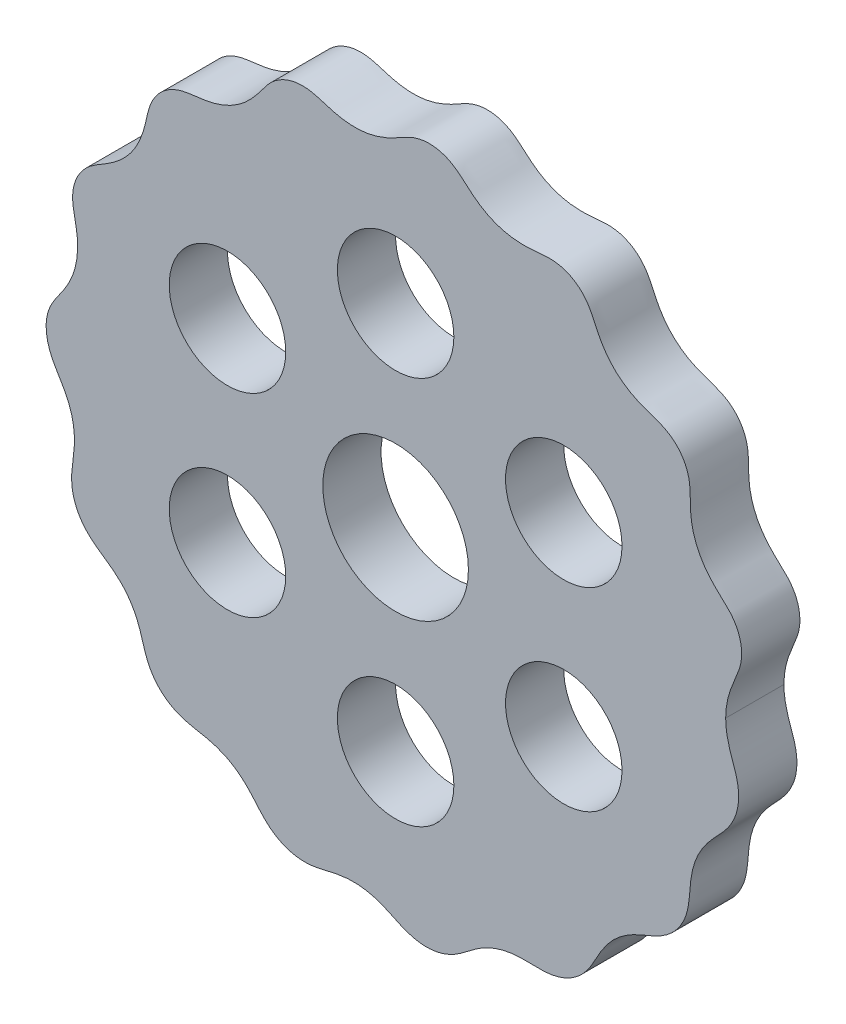
ISO-10303-21;
HEADER;
FILE_DESCRIPTION(('STEP AP214'),'2;1');
FILE_NAME('part.step','',(''),(''),'','','');
FILE_SCHEMA(('AUTOMOTIVE_DESIGN { 1 0 10303 214 1 1 1 1 }'));
ENDSEC;
DATA;
#1=APPLICATION_CONTEXT('core data for automotive mechanical design processes');
#2=APPLICATION_PROTOCOL_DEFINITION('international standard','automotive_design',2000,#1);
#3=PRODUCT_CONTEXT('',#1,'mechanical');
#4=PRODUCT('Part','Part','',(#3));
#5=PRODUCT_RELATED_PRODUCT_CATEGORY('part','',(#4));
#6=PRODUCT_DEFINITION_FORMATION('','',#4);
#7=PRODUCT_DEFINITION_CONTEXT('part definition',#1,'design');
#8=PRODUCT_DEFINITION('design','',#6,#7);
#9=PRODUCT_DEFINITION_SHAPE('','',#8);
#10=(LENGTH_UNIT() NAMED_UNIT(*) SI_UNIT(.MILLI.,.METRE.));
#11=(NAMED_UNIT(*) PLANE_ANGLE_UNIT() SI_UNIT($,.RADIAN.));
#12=(NAMED_UNIT(*) SI_UNIT($,.STERADIAN.) SOLID_ANGLE_UNIT());
#13=UNCERTAINTY_MEASURE_WITH_UNIT(LENGTH_MEASURE(1.E-05),#10,'distance_accuracy_value','');
#14=(GEOMETRIC_REPRESENTATION_CONTEXT(3) GLOBAL_UNCERTAINTY_ASSIGNED_CONTEXT((#13)) GLOBAL_UNIT_ASSIGNED_CONTEXT((#10,
#11,#12)) REPRESENTATION_CONTEXT('',''));
#15=CARTESIAN_POINT('',(0.,0.,0.));
#16=DIRECTION('',(0.,0.,1.));
#17=DIRECTION('',(1.,0.,0.));
#18=AXIS2_PLACEMENT_3D('',#15,#16,#17);
#19=CARTESIAN_POINT('',(33.9999778330542,0.,6.));
#20=CARTESIAN_POINT('',(33.9999582386087,0.228183089989129,6.));
#21=CARTESIAN_POINT('',(34.0167459934608,0.656452047963379,6.));
#22=CARTESIAN_POINT('',(34.0880773171331,1.2816899102247,6.));
#23=CARTESIAN_POINT('',(34.2663122514632,2.09233668141416,6.));
#24=CARTESIAN_POINT('',(34.5100402574252,2.85500321290993,6.));
#25=CARTESIAN_POINT('',(34.8290196473051,3.65501936744981,6.));
#26=CARTESIAN_POINT('',(35.2085863673881,4.4915049653763,6.));
#27=CARTESIAN_POINT('',(35.5972392107982,5.54756453449823,6.));
#28=CARTESIAN_POINT('',(35.7258169117513,6.85586574150502,6.));
#29=CARTESIAN_POINT('',(35.4647134850186,8.11090051834524,6.));
#30=CARTESIAN_POINT('',(34.8779639663519,9.19851543970629,6.));
#31=CARTESIAN_POINT('',(34.0796749819764,10.0967061974764,6.));
#32=CARTESIAN_POINT('',(33.1735909977777,10.8774347309762,6.));
#33=CARTESIAN_POINT('',(32.2197133598311,11.8371862296768,6.));
#34=CARTESIAN_POINT('',(31.3521738759437,13.0745174312376,6.));
#35=CARTESIAN_POINT('',(30.7401986033758,14.4567098229339,6.));
#36=CARTESIAN_POINT('',(30.4068471241229,15.9306563911616,6.));
#37=CARTESIAN_POINT('',(30.336175910127,17.2816613837377,6.));
#38=CARTESIAN_POINT('',(30.3620953861146,18.4775959702686,6.));
#39=CARTESIAN_POINT('',(30.2213186905391,19.6711372494043,6.));
#40=CARTESIAN_POINT('',(29.8066350274046,20.8086092685016,6.));
#41=CARTESIAN_POINT('',(29.086570751207,21.7902687832337,6.));
#42=CARTESIAN_POINT('',(28.125966437522,22.5272972451436,6.));
#43=CARTESIAN_POINT('',(27.0305304657638,23.0209477912322,6.));
#44=CARTESIAN_POINT('',(25.8851002190669,23.3654834792607,6.));
#45=CARTESIAN_POINT('',(24.6238833277634,23.8558411767164,6.));
#46=CARTESIAN_POINT('',(23.329119317603,24.6350349887215,6.));
#47=CARTESIAN_POINT('',(22.209422134961,25.6504695685708,6.));
#48=CARTESIAN_POINT('',(21.3069969449513,26.8625513693492,6.));
#49=CARTESIAN_POINT('',(20.6943571374257,28.0686427807888,6.));
#50=CARTESIAN_POINT('',(20.2314302939395,29.171730067991,6.));
#51=CARTESIAN_POINT('',(19.61509081782,30.2035877281515,6.));
#52=CARTESIAN_POINT('',(18.7715178883611,31.0719968916319,6.));
#53=CARTESIAN_POINT('',(17.7129956099512,31.6734082557788,6.));
#54=CARTESIAN_POINT('',(16.5349671026585,31.9531464495383,6.));
#55=CARTESIAN_POINT('',(15.3335036583515,31.9560411504276,6.));
#56=CARTESIAN_POINT('',(14.1469681143591,31.8048653548074,6.));
#57=CARTESIAN_POINT('',(12.7951965186699,31.741407901792,6.));
#58=CARTESIAN_POINT('',(11.2957561693692,31.9286316389394,6.));
#59=CARTESIAN_POINT('',(9.86058989795352,32.4029530027056,6.));
#60=CARTESIAN_POINT('',(8.54420059259727,33.1449070966544,6.));
#61=CARTESIAN_POINT('',(7.49497706019048,33.9986981181707,6.));
#62=CARTESIAN_POINT('',(6.62323588673544,34.8180525320015,6.));
#63=CARTESIAN_POINT('',(5.63886632947515,35.5079668611277,6.));
#64=CARTESIAN_POINT('',(4.51517510375975,35.9549564981424,6.));
#65=CARTESIAN_POINT('',(3.30782511719597,36.0710085077658,6.));
#66=CARTESIAN_POINT('',(2.12602546584793,35.8479176371124,6.));
#67=CARTESIAN_POINT('',(1.03474661898015,35.36751308196,6.));
#68=CARTESIAN_POINT('',(0.0196373351776417,34.7521262554792,6.));
#69=CARTESIAN_POINT('',(-1.18148345743592,34.1444477722018,6.));
#70=CARTESIAN_POINT('',(-2.6210488215956,33.7018156054838,6.));
#71=CARTESIAN_POINT('',(-4.11946006557312,33.5448788804975,6.));
#72=CARTESIAN_POINT('',(-5.61949935331476,33.6795334823496,6.));
#73=CARTESIAN_POINT('',(-6.9204762246916,34.0249254119513,6.));
#74=CARTESIAN_POINT('',(-8.04137525589883,34.4157732704649,6.));
#75=CARTESIAN_POINT('',(-9.20898095313966,34.6575607185649,6.));
#76=CARTESIAN_POINT('',(-10.411300211759,34.6285963624385,6.));
#77=CARTESIAN_POINT('',(-11.567697475318,34.2626758344416,6.));
#78=CARTESIAN_POINT('',(-12.5730910269794,33.5905946660738,6.));
#79=CARTESIAN_POINT('',(-13.3915054603063,32.7102397762244,6.));
#80=CARTESIAN_POINT('',(-14.0737297873233,31.7275291954276,6.));
#81=CARTESIAN_POINT('',(-14.9231190931441,30.6746982172873,6.));
#82=CARTESIAN_POINT('',(-16.057133773894,29.6759933871886,6.));
#83=CARTESIAN_POINT('',(-17.3628926828304,28.9145801249719,6.));
#84=CARTESIAN_POINT('',(-18.790998994427,28.4206359555158,6.));
#85=CARTESIAN_POINT('',(-20.126520240224,28.2024197165054,6.));
#86=CARTESIAN_POINT('',(-21.3185635069986,28.103571596997,6.));
#87=CARTESIAN_POINT('',(-22.4929366620818,27.8496912865206,6.));
#88=CARTESIAN_POINT('',(-23.5864200696788,27.3298039188296,6.));
#89=CARTESIAN_POINT('',(-24.4958011561164,26.520371159017,6.));
#90=CARTESIAN_POINT('',(-25.1391440777004,25.4947553607733,6.));
#91=CARTESIAN_POINT('',(-25.526223343432,24.3569289166232,6.));
#92=CARTESIAN_POINT('',(-25.7495926803989,23.1817212009888,6.));
#93=CARTESIAN_POINT('',(-26.0988273146321,21.8747640622342,6.));
#94=CARTESIAN_POINT('',(-26.7304320603804,20.5019364797606,6.));
#95=CARTESIAN_POINT('',(-27.6154485745189,19.2765183790746,6.));
#96=CARTESIAN_POINT('',(-28.7206199052791,18.2458806377954,6.));
#97=CARTESIAN_POINT('',(-29.8527123735666,17.5046840872158,6.));
#98=CARTESIAN_POINT('',(-30.901455131793,16.9294970827997,6.));
#99=CARTESIAN_POINT('',(-31.8695844361435,16.2178323415057,6.));
#100=CARTESIAN_POINT('',(-32.6548275722907,15.2962324243465,6.));
#101=CARTESIAN_POINT('',(-33.1537328627323,14.1857216740049,6.));
#102=CARTESIAN_POINT('',(-33.3213965629222,12.9866702695897,6.));
#103=CARTESIAN_POINT('',(-33.209657995365,11.7901119741777,6.));
#104=CARTESIAN_POINT('',(-32.9355752883917,10.6257389607653,6.));
#105=CARTESIAN_POINT('',(-32.7245770256088,9.28941551395651,6.));
#106=CARTESIAN_POINT('',(-32.7451534196813,7.77834761763928,6.));
#107=CARTESIAN_POINT('',(-33.0575150202973,6.2993735950604,6.));
#108=CARTESIAN_POINT('',(-33.6496839862451,4.90903330763856,6.));
#109=CARTESIAN_POINT('',(-34.3839357328533,3.77248408758148,6.));
#110=CARTESIAN_POINT('',(-35.1076456628644,2.82024573953037,6.));
#111=CARTESIAN_POINT('',(-35.607878014355,1.93924969101183,6.));
#112=CARTESIAN_POINT('',(-35.8805116156034,1.15882269935486,6.));
#113=CARTESIAN_POINT('',(-35.9793808622037,0.56521716066261,6.));
#114=CARTESIAN_POINT('',(-36.0000338817722,0.188775120943961,6.));
#115=CARTESIAN_POINT('',(-36.0000220706772,0.,6.));
#116=B_SPLINE_CURVE_WITH_KNOTS('',4,(#19,#20,#21,#22,#23,#24,#25,#26,#27,#28,#29,#30,#31,#32,
#33,#34,#35,#36,#37,#38,#39,#40,#41,#42,#43,#44,#45,#46,#47,#48,#49,#50,#51,#52,#53,#54,#55,#56,
#57,#58,#59,#60,#61,#62,#63,#64,#65,#66,#67,#68,#69,#70,#71,#72,#73,#74,#75,#76,#77,#78,#79,#80,
#81,#82,#83,#84,#85,#86,#87,#88,#89,#90,#91,#92,#93,#94,#95,#96,#97,#98,#99,#100,#101,#102,#103,
#104,#105,#106,#107,#108,#109,#110,#111,#112,#113,#114,#115),.UNSPECIFIED.,.F.,.F.,(5,1,1,1,1,1,
1,1,1,1,1,1,1,1,1,1,1,1,1,1,1,1,1,1,1,1,1,1,1,1,1,1,1,1,1,1,1,1,1,1,1,1,1,1,1,1,1,1,1,1,1,1,1,1,
1,1,1,1,1,1,1,1,1,1,1,1,1,1,1,1,1,1,1,1,1,1,1,1,1,1,1,1,1,1,1,1,1,1,1,1,1,1,1,5),
(0.11764758489827,0.123712417731234,0.129030178053502,0.134347938375769,0.139665698698036,
0.144983459020303,0.15189115648836,0.158798853956417,0.169437032133219,0.179415757090033,
0.185337291250825,0.191258825411617,0.201234407169665,0.211209988927714,0.221196437484353,
0.231182886040993,0.241158155609122,0.25113342517725,0.257054833385721,0.262976241594192,
0.272955005979324,0.282933715956385,0.288855305280604,0.294776894604823,0.304753064934742,
0.31472923526466,0.324714672149265,0.33470010903387,0.344675781916405,0.354651454798939,
0.360572828041754,0.366494201284569,0.376472978516404,0.386451672963794,0.392373323735329,
0.398294974506865,0.408271669463963,0.418248364421061,0.428232557801162,0.438216751181263,
0.44819311272311,0.458169474264956,0.464090816910954,0.470012159556952,0.47999094907712,
0.489936444745961,0.49577217370632,0.501607902666679,0.511549628293616,0.521491353920553,
0.531445711947387,0.541400069974221,0.55134167059386,0.561283271213498,0.567119001167881,
0.572954731122265,0.582900219822557,0.592879003268316,0.598800360687633,0.604721718106951,
0.614697699000446,0.624673679893942,0.634658413520395,0.644643147146849,0.654619698927079,
0.664596250707309,0.670517869940925,0.676439489174542,0.686418191455238,0.696396962333544,
0.702318352491721,0.708239742649898,0.718215178863613,0.728190615077329,0.738176623669682,
0.748162632262035,0.758138478743363,0.768114325224691,0.774035886210069,0.779957447195446,
0.789936164731374,0.799914922483703,0.805836349921885,0.811757777360066,0.821732948962338,
0.831708120564609,0.841694877193685,0.851681633822761,0.86165701148314,0.871632389143519,
0.877553897939325,0.883475406735132,0.888464772854771,0.893482590846806),.UNSPECIFIED.);
#117=DIRECTION('',(0.,0.,-1.));
#118=VECTOR('',#117,1.);
#119=SURFACE_OF_LINEAR_EXTRUSION('',#116,#118);
#120=CARTESIAN_POINT('',(33.9999778330542,0.,0.));
#121=CARTESIAN_POINT('',(33.9999582386087,0.228183089989129,0.));
#122=CARTESIAN_POINT('',(34.0167459934608,0.656452047963379,0.));
#123=CARTESIAN_POINT('',(34.0880773171331,1.2816899102247,0.));
#124=CARTESIAN_POINT('',(34.2663122514632,2.09233668141416,0.));
#125=CARTESIAN_POINT('',(34.5100402574252,2.85500321290993,0.));
#126=CARTESIAN_POINT('',(34.8290196473051,3.65501936744981,0.));
#127=CARTESIAN_POINT('',(35.2085863673881,4.4915049653763,0.));
#128=CARTESIAN_POINT('',(35.5972392107982,5.54756453449823,0.));
#129=CARTESIAN_POINT('',(35.7258169117513,6.85586574150502,0.));
#130=CARTESIAN_POINT('',(35.4647134850186,8.11090051834524,0.));
#131=CARTESIAN_POINT('',(34.8779639663519,9.19851543970629,0.));
#132=CARTESIAN_POINT('',(34.0796749819764,10.0967061974764,0.));
#133=CARTESIAN_POINT('',(33.1735909977777,10.8774347309762,0.));
#134=CARTESIAN_POINT('',(32.2197133598311,11.8371862296768,0.));
#135=CARTESIAN_POINT('',(31.3521738759437,13.0745174312376,0.));
#136=CARTESIAN_POINT('',(30.7401986033758,14.4567098229339,0.));
#137=CARTESIAN_POINT('',(30.4068471241229,15.9306563911616,0.));
#138=CARTESIAN_POINT('',(30.336175910127,17.2816613837377,0.));
#139=CARTESIAN_POINT('',(30.3620953861146,18.4775959702686,0.));
#140=CARTESIAN_POINT('',(30.2213186905391,19.6711372494043,0.));
#141=CARTESIAN_POINT('',(29.8066350274046,20.8086092685016,0.));
#142=CARTESIAN_POINT('',(29.086570751207,21.7902687832337,0.));
#143=CARTESIAN_POINT('',(28.125966437522,22.5272972451436,0.));
#144=CARTESIAN_POINT('',(27.0305304657638,23.0209477912322,0.));
#145=CARTESIAN_POINT('',(25.8851002190669,23.3654834792607,0.));
#146=CARTESIAN_POINT('',(24.6238833277634,23.8558411767164,0.));
#147=CARTESIAN_POINT('',(23.329119317603,24.6350349887215,0.));
#148=CARTESIAN_POINT('',(22.209422134961,25.6504695685708,0.));
#149=CARTESIAN_POINT('',(21.3069969449513,26.8625513693492,0.));
#150=CARTESIAN_POINT('',(20.6943571374257,28.0686427807888,0.));
#151=CARTESIAN_POINT('',(20.2314302939395,29.171730067991,0.));
#152=CARTESIAN_POINT('',(19.61509081782,30.2035877281515,0.));
#153=CARTESIAN_POINT('',(18.7715178883611,31.0719968916319,0.));
#154=CARTESIAN_POINT('',(17.7129956099512,31.6734082557788,0.));
#155=CARTESIAN_POINT('',(16.5349671026585,31.9531464495383,0.));
#156=CARTESIAN_POINT('',(15.3335036583515,31.9560411504276,0.));
#157=CARTESIAN_POINT('',(14.1469681143591,31.8048653548074,0.));
#158=CARTESIAN_POINT('',(12.7951965186699,31.741407901792,0.));
#159=CARTESIAN_POINT('',(11.2957561693692,31.9286316389394,0.));
#160=CARTESIAN_POINT('',(9.86058989795352,32.4029530027056,0.));
#161=CARTESIAN_POINT('',(8.54420059259727,33.1449070966544,0.));
#162=CARTESIAN_POINT('',(7.49497706019048,33.9986981181707,0.));
#163=CARTESIAN_POINT('',(6.62323588673544,34.8180525320015,0.));
#164=CARTESIAN_POINT('',(5.63886632947515,35.5079668611277,0.));
#165=CARTESIAN_POINT('',(4.51517510375975,35.9549564981424,0.));
#166=CARTESIAN_POINT('',(3.30782511719597,36.0710085077658,0.));
#167=CARTESIAN_POINT('',(2.12602546584793,35.8479176371124,0.));
#168=CARTESIAN_POINT('',(1.03474661898015,35.36751308196,0.));
#169=CARTESIAN_POINT('',(0.0196373351776417,34.7521262554792,0.));
#170=CARTESIAN_POINT('',(-1.18148345743592,34.1444477722018,0.));
#171=CARTESIAN_POINT('',(-2.6210488215956,33.7018156054838,0.));
#172=CARTESIAN_POINT('',(-4.11946006557312,33.5448788804975,0.));
#173=CARTESIAN_POINT('',(-5.61949935331476,33.6795334823496,0.));
#174=CARTESIAN_POINT('',(-6.9204762246916,34.0249254119513,0.));
#175=CARTESIAN_POINT('',(-8.04137525589883,34.4157732704649,0.));
#176=CARTESIAN_POINT('',(-9.20898095313966,34.6575607185649,0.));
#177=CARTESIAN_POINT('',(-10.411300211759,34.6285963624385,0.));
#178=CARTESIAN_POINT('',(-11.567697475318,34.2626758344416,0.));
#179=CARTESIAN_POINT('',(-12.5730910269794,33.5905946660738,0.));
#180=CARTESIAN_POINT('',(-13.3915054603063,32.7102397762244,0.));
#181=CARTESIAN_POINT('',(-14.0737297873233,31.7275291954276,0.));
#182=CARTESIAN_POINT('',(-14.9231190931441,30.6746982172873,0.));
#183=CARTESIAN_POINT('',(-16.057133773894,29.6759933871886,0.));
#184=CARTESIAN_POINT('',(-17.3628926828304,28.9145801249719,0.));
#185=CARTESIAN_POINT('',(-18.790998994427,28.4206359555158,0.));
#186=CARTESIAN_POINT('',(-20.126520240224,28.2024197165054,0.));
#187=CARTESIAN_POINT('',(-21.3185635069986,28.103571596997,0.));
#188=CARTESIAN_POINT('',(-22.4929366620818,27.8496912865206,0.));
#189=CARTESIAN_POINT('',(-23.5864200696788,27.3298039188296,0.));
#190=CARTESIAN_POINT('',(-24.4958011561164,26.520371159017,0.));
#191=CARTESIAN_POINT('',(-25.1391440777004,25.4947553607733,0.));
#192=CARTESIAN_POINT('',(-25.526223343432,24.3569289166232,0.));
#193=CARTESIAN_POINT('',(-25.7495926803989,23.1817212009888,0.));
#194=CARTESIAN_POINT('',(-26.0988273146321,21.8747640622342,0.));
#195=CARTESIAN_POINT('',(-26.7304320603804,20.5019364797606,0.));
#196=CARTESIAN_POINT('',(-27.6154485745189,19.2765183790746,0.));
#197=CARTESIAN_POINT('',(-28.7206199052791,18.2458806377954,0.));
#198=CARTESIAN_POINT('',(-29.8527123735666,17.5046840872158,0.));
#199=CARTESIAN_POINT('',(-30.901455131793,16.9294970827997,0.));
#200=CARTESIAN_POINT('',(-31.8695844361435,16.2178323415057,0.));
#201=CARTESIAN_POINT('',(-32.6548275722907,15.2962324243465,0.));
#202=CARTESIAN_POINT('',(-33.1537328627323,14.1857216740049,0.));
#203=CARTESIAN_POINT('',(-33.3213965629222,12.9866702695897,0.));
#204=CARTESIAN_POINT('',(-33.209657995365,11.7901119741777,0.));
#205=CARTESIAN_POINT('',(-32.9355752883917,10.6257389607653,0.));
#206=CARTESIAN_POINT('',(-32.7245770256088,9.28941551395651,0.));
#207=CARTESIAN_POINT('',(-32.7451534196813,7.77834761763928,0.));
#208=CARTESIAN_POINT('',(-33.0575150202973,6.2993735950604,0.));
#209=CARTESIAN_POINT('',(-33.6496839862451,4.90903330763856,0.));
#210=CARTESIAN_POINT('',(-34.3839357328533,3.77248408758148,0.));
#211=CARTESIAN_POINT('',(-35.1076456628644,2.82024573953037,0.));
#212=CARTESIAN_POINT('',(-35.607878014355,1.93924969101183,0.));
#213=CARTESIAN_POINT('',(-35.8805116156034,1.15882269935486,0.));
#214=CARTESIAN_POINT('',(-35.9793808622037,0.56521716066261,0.));
#215=CARTESIAN_POINT('',(-36.0000338817722,0.188775120943961,0.));
#216=CARTESIAN_POINT('',(-36.0000220706772,0.,0.));
#217=B_SPLINE_CURVE_WITH_KNOTS('',4,(#120,#121,#122,#123,#124,#125,#126,#127,#128,#129,#130,
#131,#132,#133,#134,#135,#136,#137,#138,#139,#140,#141,#142,#143,#144,#145,#146,#147,#148,#149,
#150,#151,#152,#153,#154,#155,#156,#157,#158,#159,#160,#161,#162,#163,#164,#165,#166,#167,#168,
#169,#170,#171,#172,#173,#174,#175,#176,#177,#178,#179,#180,#181,#182,#183,#184,#185,#186,#187,
#188,#189,#190,#191,#192,#193,#194,#195,#196,#197,#198,#199,#200,#201,#202,#203,#204,#205,#206,
#207,#208,#209,#210,#211,#212,#213,#214,#215,#216),.UNSPECIFIED.,.F.,.F.,(5,1,1,1,1,1,1,1,1,1,1,
1,1,1,1,1,1,1,1,1,1,1,1,1,1,1,1,1,1,1,1,1,1,1,1,1,1,1,1,1,1,1,1,1,1,1,1,1,1,1,1,1,1,1,1,1,1,1,1,
1,1,1,1,1,1,1,1,1,1,1,1,1,1,1,1,1,1,1,1,1,1,1,1,1,1,1,1,1,1,1,1,1,1,5),(0.11764758489827,
0.123712417731234,0.129030178053502,0.134347938375769,0.139665698698036,0.144983459020303,
0.15189115648836,0.158798853956417,0.169437032133219,0.179415757090033,0.185337291250825,
0.191258825411617,0.201234407169665,0.211209988927714,0.221196437484353,0.231182886040993,
0.241158155609122,0.25113342517725,0.257054833385721,0.262976241594192,0.272955005979324,
0.282933715956385,0.288855305280604,0.294776894604823,0.304753064934742,0.31472923526466,
0.324714672149265,0.33470010903387,0.344675781916405,0.354651454798939,0.360572828041754,
0.366494201284569,0.376472978516404,0.386451672963794,0.392373323735329,0.398294974506865,
0.408271669463963,0.418248364421061,0.428232557801162,0.438216751181263,0.44819311272311,
0.458169474264956,0.464090816910954,0.470012159556952,0.47999094907712,0.489936444745961,
0.49577217370632,0.501607902666679,0.511549628293616,0.521491353920553,0.531445711947387,
0.541400069974221,0.55134167059386,0.561283271213498,0.567119001167881,0.572954731122265,
0.582900219822557,0.592879003268316,0.598800360687633,0.604721718106951,0.614697699000446,
0.624673679893942,0.634658413520395,0.644643147146849,0.654619698927079,0.664596250707309,
0.670517869940925,0.676439489174542,0.686418191455238,0.696396962333544,0.702318352491721,
0.708239742649898,0.718215178863613,0.728190615077329,0.738176623669682,0.748162632262035,
0.758138478743363,0.768114325224691,0.774035886210069,0.779957447195446,0.789936164731374,
0.799914922483703,0.805836349921885,0.811757777360066,0.821732948962338,0.831708120564609,
0.841694877193685,0.851681633822761,0.86165701148314,0.871632389143519,0.877553897939325,
0.883475406735132,0.888464772854771,0.893482590846806),.UNSPECIFIED.);
#218=CARTESIAN_POINT('',(33.9999778330542,7.6549099124626E-13,0.));
#219=VERTEX_POINT('',#218);
#220=CARTESIAN_POINT('',(-36.0000220706769,-5.62943543193529E-10,0.));
#221=VERTEX_POINT('',#220);
#222=EDGE_CURVE('E75',#219,#221,#217,.T.);
#223=ORIENTED_EDGE('',*,*,#222,.T.);
#224=DIRECTION('',(0.,0.,-1.));
#225=VECTOR('',#224,1.);
#226=CARTESIAN_POINT('',(-36.0000220706769,-5.62943543193529E-10,6.));
#227=LINE('',#226,#225);
#228=CARTESIAN_POINT('',(-36.0000220706769,-5.62943543193529E-10,6.));
#229=VERTEX_POINT('',#228);
#230=EDGE_CURVE('E11',#229,#221,#227,.T.);
#231=ORIENTED_EDGE('',*,*,#230,.F.);
#232=CARTESIAN_POINT('',(33.9999778330542,7.6549099124626E-13,6.));
#233=VERTEX_POINT('',#232);
#234=EDGE_CURVE('E74',#233,#229,#116,.T.);
#235=ORIENTED_EDGE('',*,*,#234,.F.);
#236=DIRECTION('',(0.,0.,-1.));
#237=VECTOR('',#236,1.);
#238=CARTESIAN_POINT('',(33.9999778330542,7.6549099124626E-13,6.));
#239=LINE('',#238,#237);
#240=EDGE_CURVE('E52',#233,#219,#239,.T.);
#241=ORIENTED_EDGE('',*,*,#240,.T.);
#242=EDGE_LOOP('',(#223,#231,#235,#241));
#243=FACE_BOUND('',#242,.T.);
#244=ADVANCED_FACE('F43',(#243),#119,.F.);
#245=CARTESIAN_POINT('',(-36.0000220706769,-5.62943543193529E-10,6.));
#246=CARTESIAN_POINT('',(-36.0000065394833,-0.035587452021318,6.));
#247=CARTESIAN_POINT('',(-35.9993566360993,-0.0892186674692923,6.));
#248=CARTESIAN_POINT('',(-35.9972275133063,-0.182583996635181,6.));
#249=CARTESIAN_POINT('',(-35.9924701459357,-0.294036464658167,6.));
#250=CARTESIAN_POINT('',(-35.987393491433,-0.37929454165697,6.));
#251=CARTESIAN_POINT('',(-35.9794724767395,-0.482964700256424,6.));
#252=CARTESIAN_POINT('',(-35.9674508238095,-0.607434226564926,6.));
#253=CARTESIAN_POINT('',(-35.949768502872,-0.754373951912758,6.));
#254=CARTESIAN_POINT('',(-35.9245789790743,-0.92071979607577,6.));
#255=CARTESIAN_POINT('',(-35.8944505516151,-1.08626622648199,6.));
#256=CARTESIAN_POINT('',(-35.8331835910926,-1.37437747352898,6.));
#257=CARTESIAN_POINT('',(-35.7215890492575,-1.78042168887151,6.));
#258=CARTESIAN_POINT('',(-35.5347848720043,-2.28560963035172,6.));
#259=CARTESIAN_POINT('',(-35.2470757855512,-2.87425398505704,6.));
#260=CARTESIAN_POINT('',(-34.9229913770931,-3.43217737616594,6.));
#261=CARTESIAN_POINT('',(-34.5881332018933,-3.97238305528121,6.));
#262=CARTESIAN_POINT('',(-34.2240073584578,-4.57834573717451,6.));
#263=CARTESIAN_POINT('',(-33.8574540726477,-5.26542107290376,6.));
#264=CARTESIAN_POINT('',(-33.5484237086123,-5.99156499783688,6.));
#265=CARTESIAN_POINT('',(-33.3143015734883,-6.75500541517757,6.));
#266=CARTESIAN_POINT('',(-33.151780812424,-7.56287004960922,6.));
#267=CARTESIAN_POINT('',(-33.0701335332422,-8.40954667444264,6.));
#268=CARTESIAN_POINT('',(-33.0854282095193,-9.38414879507724,6.));
#269=CARTESIAN_POINT('',(-33.2137837264978,-10.4733681405721,6.));
#270=CARTESIAN_POINT('',(-33.3891198926942,-11.6366247862912,6.));
#271=CARTESIAN_POINT('',(-33.4088352859984,-12.9009344917495,6.));
#272=CARTESIAN_POINT('',(-33.1376762381004,-14.1875727698279,6.));
#273=CARTESIAN_POINT('',(-32.5494026830376,-15.4123266749087,6.));
#274=CARTESIAN_POINT('',(-31.7964126256323,-16.3271606526055,6.));
#275=CARTESIAN_POINT('',(-31.0280300525459,-16.9711805211944,6.));
#276=CARTESIAN_POINT('',(-30.2174930398594,-17.5401900902958,6.));
#277=CARTESIAN_POINT('',(-29.3222070695194,-18.1419645882163,6.));
#278=CARTESIAN_POINT('',(-28.3432265614791,-18.9311154274278,6.));
#279=CARTESIAN_POINT('',(-27.4599628253411,-19.959232839154,6.));
#280=CARTESIAN_POINT('',(-26.8127933213575,-21.0635410260059,6.));
#281=CARTESIAN_POINT('',(-26.3784010601342,-22.1126546194113,6.));
#282=CARTESIAN_POINT('',(-26.0637292054357,-23.1451846870684,6.));
#283=CARTESIAN_POINT('',(-25.7503603018565,-24.2611809296458,6.));
#284=CARTESIAN_POINT('',(-25.2537692534519,-25.4044220502984,6.));
#285=CARTESIAN_POINT('',(-24.4832679165418,-26.4585840687755,6.));
#286=CARTESIAN_POINT('',(-23.4434139422606,-27.3333611527097,6.));
#287=CARTESIAN_POINT('',(-22.3770738472238,-27.8597771301477,6.));
#288=CARTESIAN_POINT('',(-21.4031548284599,-28.1334895656854,6.));
#289=CARTESIAN_POINT('',(-20.5781912687492,-28.2919876867001,6.));
#290=CARTESIAN_POINT('',(-19.9174275896504,-28.4116168826251,6.));
#291=CARTESIAN_POINT('',(-19.0257886944982,-28.6003393425514,6.));
#292=CARTESIAN_POINT('',(-17.9899068405375,-28.9158489527288,6.));
#293=CARTESIAN_POINT('',(-16.9214177197429,-29.4299635886853,6.));
#294=CARTESIAN_POINT('',(-15.8846572224785,-30.1811796943348,6.));
#295=CARTESIAN_POINT('',(-15.0539624661726,-30.9806483338331,6.));
#296=CARTESIAN_POINT('',(-14.3407064181957,-31.8131244082474,6.));
#297=CARTESIAN_POINT('',(-13.5904183856599,-32.7073505861721,6.));
#298=CARTESIAN_POINT('',(-12.6589218103666,-33.5353224211952,6.));
#299=CARTESIAN_POINT('',(-11.5163846505849,-34.1653336776814,6.));
#300=CARTESIAN_POINT('',(-10.3517115162416,-34.4801655982209,6.));
#301=CARTESIAN_POINT('',(-9.30484756757346,-34.5412025731469,6.));
#302=CARTESIAN_POINT('',(-8.2640184090618,-34.4419393897703,6.));
#303=CARTESIAN_POINT('',(-7.2456727993519,-34.2103326891867,6.));
#304=CARTESIAN_POINT('',(-6.03823842549489,-33.8967568454827,6.));
#305=CARTESIAN_POINT('',(-4.64304178356501,-33.7202270280699,6.));
#306=CARTESIAN_POINT('',(-3.29933531545874,-33.7924531233624,6.));
#307=CARTESIAN_POINT('',(-2.05286803834594,-34.0856034296582,6.));
#308=CARTESIAN_POINT('',(-0.97713549426737,-34.5009029210439,6.));
#309=CARTESIAN_POINT('',(-0.00758589651340478,-34.9741927707536,6.));
#310=CARTESIAN_POINT('',(1.02609954780046,-35.4596639217677,6.));
#311=CARTESIAN_POINT('',(2.18722226415819,-35.8034128326469,6.));
#312=CARTESIAN_POINT('',(3.47163571878525,-35.8916317312475,6.));
#313=CARTESIAN_POINT('',(4.84476166273807,-35.6528739754701,6.));
#314=CARTESIAN_POINT('',(5.9633244056776,-35.1529189806905,6.));
#315=CARTESIAN_POINT('',(6.82398883733321,-34.5580390481195,6.));
#316=CARTESIAN_POINT('',(7.64834936047422,-33.9184046128472,6.));
#317=CARTESIAN_POINT('',(8.48395513197813,-33.2903712935274,6.));
#318=CARTESIAN_POINT('',(9.53129550538832,-32.6675938468539,6.));
#319=CARTESIAN_POINT('',(10.7832421489812,-32.1991066066016,6.));
#320=CARTESIAN_POINT('',(12.0420899256325,-31.9658948896855,6.));
#321=CARTESIAN_POINT('',(13.2034297824994,-31.9153657845447,6.));
#322=CARTESIAN_POINT('',(14.2810665447659,-31.9568430067728,6.));
#323=CARTESIAN_POINT('',(15.4145417525695,-31.9722226286477,6.));
#324=CARTESIAN_POINT('',(16.5954875914625,-31.808607453233,6.));
#325=CARTESIAN_POINT('',(17.795027210966,-31.3642704215513,6.));
#326=CARTESIAN_POINT('',(18.9623103196136,-30.5720676842708,6.));
#327=CARTESIAN_POINT('',(19.8999888760707,-29.5114281966015,6.));
#328=CARTESIAN_POINT('',(20.5698969586336,-28.2799932026196,6.));
#329=CARTESIAN_POINT('',(21.2346994048076,-27.0309850944338,6.));
#330=CARTESIAN_POINT('',(22.038544046321,-25.9202703855751,6.));
#331=CARTESIAN_POINT('',(22.9894549608835,-24.9959465013735,6.));
#332=CARTESIAN_POINT('',(24.0494782778463,-24.2760150554438,6.));
#333=CARTESIAN_POINT('',(25.108257862384,-23.7567625562203,6.));
#334=CARTESIAN_POINT('',(26.1272284619129,-23.3539512634933,6.));
#335=CARTESIAN_POINT('',(27.1720509651388,-22.8941594216777,6.));
#336=CARTESIAN_POINT('',(28.1740081446768,-22.2485843546083,6.));
#337=CARTESIAN_POINT('',(29.0729503606832,-21.3399804152635,6.));
#338=CARTESIAN_POINT('',(29.8159099638863,-20.0989156215148,6.));
#339=CARTESIAN_POINT('',(30.2160293122575,-18.7036716873027,6.));
#340=CARTESIAN_POINT('',(30.2990989358974,-17.2709782759213,6.));
#341=CARTESIAN_POINT('',(30.4261383381775,-15.843848461063,6.));
#342=CARTESIAN_POINT('',(30.7375284732212,-14.5270478620618,6.));
#343=CARTESIAN_POINT('',(31.2642835747463,-13.301382565922,6.));
#344=CARTESIAN_POINT('',(31.9854532318685,-12.200018470266,6.));
#345=CARTESIAN_POINT('',(32.7831669164901,-11.2972435715911,6.));
#346=CARTESIAN_POINT('',(33.5538748625703,-10.5182980084885,6.));
#347=CARTESIAN_POINT('',(34.2768811515427,-9.66785888891602,6.));
#348=CARTESIAN_POINT('',(34.8683805627663,-8.69375245014938,6.));
#349=CARTESIAN_POINT('',(35.2768383528903,-7.5107319580321,6.));
#350=CARTESIAN_POINT('',(35.3903111858181,-6.27338510901934,6.));
#351=CARTESIAN_POINT('',(35.2561590108965,-5.16001320338575,6.));
#352=CARTESIAN_POINT('',(34.999450461026,-4.25663270106883,6.));
#353=CARTESIAN_POINT('',(34.7443629277658,-3.54051666231821,6.));
#354=CARTESIAN_POINT('',(34.5116318161947,-2.88157747982964,6.));
#355=CARTESIAN_POINT('',(34.3213107751942,-2.27301147117908,6.));
#356=CARTESIAN_POINT('',(34.1853592309599,-1.72704696743005,6.));
#357=CARTESIAN_POINT('',(34.1041500112909,-1.28926354393778,6.));
#358=CARTESIAN_POINT('',(34.0594232296769,-0.964557766278843,6.));
#359=CARTESIAN_POINT('',(34.0365646328948,-0.755399253538371,6.));
#360=CARTESIAN_POINT('',(34.0218676835024,-0.586951337741574,6.));
#361=CARTESIAN_POINT('',(34.010799334675,-0.420382149380403,6.));
#362=CARTESIAN_POINT('',(34.0034122673256,-0.255908549236203,6.));
#363=CARTESIAN_POINT('',(34.000622183771,-0.107077691775453,6.));
#364=CARTESIAN_POINT('',(33.9999898144016,-0.0355066796506771,6.));
#365=CARTESIAN_POINT('',(33.9999778330542,7.6549099124626E-13,6.));
#366=B_SPLINE_CURVE_WITH_KNOTS('',4,(#245,#246,#247,#248,#249,#250,#251,#252,#253,#254,#255,
#256,#257,#258,#259,#260,#261,#262,#263,#264,#265,#266,#267,#268,#269,#270,#271,#272,#273,#274,
#275,#276,#277,#278,#279,#280,#281,#282,#283,#284,#285,#286,#287,#288,#289,#290,#291,#292,#293,
#294,#295,#296,#297,#298,#299,#300,#301,#302,#303,#304,#305,#306,#307,#308,#309,#310,#311,#312,
#313,#314,#315,#316,#317,#318,#319,#320,#321,#322,#323,#324,#325,#326,#327,#328,#329,#330,#331,
#332,#333,#334,#335,#336,#337,#338,#339,#340,#341,#342,#343,#344,#345,#346,#347,#348,#349,#350,
#351,#352,#353,#354,#355,#356,#357,#358,#359,#360,#361,#362,#363,#364,#365),.UNSPECIFIED.,.F.,
.F.,(5,1,1,1,1,1,1,1,1,1,1,1,1,1,1,1,1,1,1,1,1,1,1,1,1,1,1,1,1,1,1,1,1,1,1,1,1,1,1,1,1,1,1,1,1,
1,1,1,1,1,1,1,1,1,1,1,1,1,1,1,1,1,1,1,1,1,1,1,1,1,1,1,1,1,1,1,1,1,1,1,1,1,1,1,1,1,1,1,1,1,1,1,1,
1,1,1,1,1,1,1,1,1,1,1,1,1,1,1,1,1,1,1,1,1,1,1,1,5),(0.0723823167309254,0.0736197631279953,
0.0742421798203514,0.0748645965127075,0.0754870132050636,0.0761094298974196,0.0773542632821318,
0.0785990966668439,0.079843930051556,0.081088763436268,0.0823335968209802,0.0873124701086591,
0.0922913433963379,0.0969929526481731,0.101694561900008,0.106396171151844,0.111097780403679,
0.117908019121749,0.124718257839819,0.129700157779019,0.13468205771822,0.142258833614539,
0.149835609510859,0.158472745945088,0.167109882379317,0.177067368234206,0.187026628572358,
0.196985794761847,0.206942074934766,0.211776984892043,0.216611894849319,0.226281714763873,
0.238870291887091,0.248835473053263,0.256425388933849,0.264015304814436,0.272387803335419,
0.280760301856402,0.290718221464224,0.300677054087431,0.310635487863385,0.320593217091368,
0.325559751613745,0.330526286136121,0.335492820658497,0.340459355180873,0.352521652170061,
0.362485245109067,0.370339946236475,0.378194647363883,0.386552924201515,0.394911201039147,
0.404869325906439,0.414828124220935,0.424786696708477,0.430258327875634,0.435729959042792,
0.445687502902636,0.45564504676248,0.467172834590989,0.477137474410178,0.485256867396169,
0.493376260382159,0.501219176721204,0.509062093060249,0.519020399155151,0.528979191143466,
0.538937767942344,0.549910891031548,0.554889184865794,0.55986747870004,0.569824066368531,
0.580824260894368,0.590788576523776,0.599172582198829,0.607556587873881,0.615134639002757,
0.622712690131632,0.632670613649877,0.64262979202552,0.652588733664654,0.664092161874919,
0.674047572106208,0.684002982337497,0.694474440947267,0.70443964732414,0.713088534101071,
0.721737420878001,0.729300482908886,0.736863544939771,0.746821711094168,0.756780811994393,
0.766739611018303,0.77927311958778,0.78921943359811,0.799165747608441,0.809126752578068,
0.819089228241024,0.828505179910183,0.837921131579341,0.844717976801878,0.851514822024414,
0.861473356209832,0.871432439616278,0.881390827733784,0.887922947624933,0.894455067516082,
0.899169791338563,0.903884515161044,0.908599238983525,0.913313962806006,0.915805016568404,
0.917050543449603,0.918296070330801,0.919541597212,0.920787124093199,0.922032650974398,
0.923267264596664),.UNSPECIFIED.);
#367=DIRECTION('',(0.,0.,-1.));
#368=VECTOR('',#367,1.);
#369=SURFACE_OF_LINEAR_EXTRUSION('',#366,#368);
#370=CARTESIAN_POINT('',(-36.0000220706769,-5.62943543193529E-10,0.));
#371=CARTESIAN_POINT('',(-36.0000065394833,-0.035587452021318,0.));
#372=CARTESIAN_POINT('',(-35.9993566360993,-0.0892186674692923,0.));
#373=CARTESIAN_POINT('',(-35.9972275133063,-0.182583996635181,0.));
#374=CARTESIAN_POINT('',(-35.9924701459357,-0.294036464658167,0.));
#375=CARTESIAN_POINT('',(-35.987393491433,-0.37929454165697,0.));
#376=CARTESIAN_POINT('',(-35.9794724767395,-0.482964700256424,0.));
#377=CARTESIAN_POINT('',(-35.9674508238095,-0.607434226564926,0.));
#378=CARTESIAN_POINT('',(-35.949768502872,-0.754373951912758,0.));
#379=CARTESIAN_POINT('',(-35.9245789790743,-0.92071979607577,0.));
#380=CARTESIAN_POINT('',(-35.8944505516151,-1.08626622648199,0.));
#381=CARTESIAN_POINT('',(-35.8331835910926,-1.37437747352898,0.));
#382=CARTESIAN_POINT('',(-35.7215890492575,-1.78042168887151,0.));
#383=CARTESIAN_POINT('',(-35.5347848720043,-2.28560963035172,0.));
#384=CARTESIAN_POINT('',(-35.2470757855512,-2.87425398505704,0.));
#385=CARTESIAN_POINT('',(-34.9229913770931,-3.43217737616594,0.));
#386=CARTESIAN_POINT('',(-34.5881332018933,-3.97238305528121,0.));
#387=CARTESIAN_POINT('',(-34.2240073584578,-4.57834573717451,0.));
#388=CARTESIAN_POINT('',(-33.8574540726477,-5.26542107290376,0.));
#389=CARTESIAN_POINT('',(-33.5484237086123,-5.99156499783688,0.));
#390=CARTESIAN_POINT('',(-33.3143015734883,-6.75500541517757,0.));
#391=CARTESIAN_POINT('',(-33.151780812424,-7.56287004960922,0.));
#392=CARTESIAN_POINT('',(-33.0701335332422,-8.40954667444264,0.));
#393=CARTESIAN_POINT('',(-33.0854282095193,-9.38414879507724,0.));
#394=CARTESIAN_POINT('',(-33.2137837264978,-10.4733681405721,0.));
#395=CARTESIAN_POINT('',(-33.3891198926942,-11.6366247862912,0.));
#396=CARTESIAN_POINT('',(-33.4088352859984,-12.9009344917495,0.));
#397=CARTESIAN_POINT('',(-33.1376762381004,-14.1875727698279,0.));
#398=CARTESIAN_POINT('',(-32.5494026830376,-15.4123266749087,0.));
#399=CARTESIAN_POINT('',(-31.7964126256323,-16.3271606526055,0.));
#400=CARTESIAN_POINT('',(-31.0280300525459,-16.9711805211944,0.));
#401=CARTESIAN_POINT('',(-30.2174930398594,-17.5401900902958,0.));
#402=CARTESIAN_POINT('',(-29.3222070695194,-18.1419645882163,0.));
#403=CARTESIAN_POINT('',(-28.3432265614791,-18.9311154274278,0.));
#404=CARTESIAN_POINT('',(-27.4599628253411,-19.959232839154,0.));
#405=CARTESIAN_POINT('',(-26.8127933213575,-21.0635410260059,0.));
#406=CARTESIAN_POINT('',(-26.3784010601342,-22.1126546194113,0.));
#407=CARTESIAN_POINT('',(-26.0637292054357,-23.1451846870684,0.));
#408=CARTESIAN_POINT('',(-25.7503603018565,-24.2611809296458,0.));
#409=CARTESIAN_POINT('',(-25.2537692534519,-25.4044220502984,0.));
#410=CARTESIAN_POINT('',(-24.4832679165418,-26.4585840687755,0.));
#411=CARTESIAN_POINT('',(-23.4434139422606,-27.3333611527097,0.));
#412=CARTESIAN_POINT('',(-22.3770738472238,-27.8597771301477,0.));
#413=CARTESIAN_POINT('',(-21.4031548284599,-28.1334895656854,0.));
#414=CARTESIAN_POINT('',(-20.5781912687492,-28.2919876867001,0.));
#415=CARTESIAN_POINT('',(-19.9174275896504,-28.4116168826251,0.));
#416=CARTESIAN_POINT('',(-19.0257886944982,-28.6003393425514,0.));
#417=CARTESIAN_POINT('',(-17.9899068405375,-28.9158489527288,0.));
#418=CARTESIAN_POINT('',(-16.9214177197429,-29.4299635886853,0.));
#419=CARTESIAN_POINT('',(-15.8846572224785,-30.1811796943348,0.));
#420=CARTESIAN_POINT('',(-15.0539624661726,-30.9806483338331,0.));
#421=CARTESIAN_POINT('',(-14.3407064181957,-31.8131244082474,0.));
#422=CARTESIAN_POINT('',(-13.5904183856599,-32.7073505861721,0.));
#423=CARTESIAN_POINT('',(-12.6589218103666,-33.5353224211952,0.));
#424=CARTESIAN_POINT('',(-11.5163846505849,-34.1653336776814,0.));
#425=CARTESIAN_POINT('',(-10.3517115162416,-34.4801655982209,0.));
#426=CARTESIAN_POINT('',(-9.30484756757346,-34.5412025731469,0.));
#427=CARTESIAN_POINT('',(-8.2640184090618,-34.4419393897703,0.));
#428=CARTESIAN_POINT('',(-7.2456727993519,-34.2103326891867,0.));
#429=CARTESIAN_POINT('',(-6.03823842549489,-33.8967568454827,0.));
#430=CARTESIAN_POINT('',(-4.64304178356501,-33.7202270280699,0.));
#431=CARTESIAN_POINT('',(-3.29933531545874,-33.7924531233624,0.));
#432=CARTESIAN_POINT('',(-2.05286803834594,-34.0856034296582,0.));
#433=CARTESIAN_POINT('',(-0.97713549426737,-34.5009029210439,0.));
#434=CARTESIAN_POINT('',(-0.00758589651340478,-34.9741927707536,0.));
#435=CARTESIAN_POINT('',(1.02609954780046,-35.4596639217677,0.));
#436=CARTESIAN_POINT('',(2.18722226415819,-35.8034128326469,0.));
#437=CARTESIAN_POINT('',(3.47163571878525,-35.8916317312475,0.));
#438=CARTESIAN_POINT('',(4.84476166273807,-35.6528739754701,0.));
#439=CARTESIAN_POINT('',(5.9633244056776,-35.1529189806905,0.));
#440=CARTESIAN_POINT('',(6.82398883733321,-34.5580390481195,0.));
#441=CARTESIAN_POINT('',(7.64834936047422,-33.9184046128472,0.));
#442=CARTESIAN_POINT('',(8.48395513197813,-33.2903712935274,0.));
#443=CARTESIAN_POINT('',(9.53129550538832,-32.6675938468539,0.));
#444=CARTESIAN_POINT('',(10.7832421489812,-32.1991066066016,0.));
#445=CARTESIAN_POINT('',(12.0420899256325,-31.9658948896855,0.));
#446=CARTESIAN_POINT('',(13.2034297824994,-31.9153657845447,0.));
#447=CARTESIAN_POINT('',(14.2810665447659,-31.9568430067728,0.));
#448=CARTESIAN_POINT('',(15.4145417525695,-31.9722226286477,0.));
#449=CARTESIAN_POINT('',(16.5954875914625,-31.808607453233,0.));
#450=CARTESIAN_POINT('',(17.795027210966,-31.3642704215513,0.));
#451=CARTESIAN_POINT('',(18.9623103196136,-30.5720676842708,0.));
#452=CARTESIAN_POINT('',(19.8999888760707,-29.5114281966015,0.));
#453=CARTESIAN_POINT('',(20.5698969586336,-28.2799932026196,0.));
#454=CARTESIAN_POINT('',(21.2346994048076,-27.0309850944338,0.));
#455=CARTESIAN_POINT('',(22.038544046321,-25.9202703855751,0.));
#456=CARTESIAN_POINT('',(22.9894549608835,-24.9959465013735,0.));
#457=CARTESIAN_POINT('',(24.0494782778463,-24.2760150554438,0.));
#458=CARTESIAN_POINT('',(25.108257862384,-23.7567625562203,0.));
#459=CARTESIAN_POINT('',(26.1272284619129,-23.3539512634933,0.));
#460=CARTESIAN_POINT('',(27.1720509651388,-22.8941594216777,0.));
#461=CARTESIAN_POINT('',(28.1740081446768,-22.2485843546083,0.));
#462=CARTESIAN_POINT('',(29.0729503606832,-21.3399804152635,0.));
#463=CARTESIAN_POINT('',(29.8159099638863,-20.0989156215148,0.));
#464=CARTESIAN_POINT('',(30.2160293122575,-18.7036716873027,0.));
#465=CARTESIAN_POINT('',(30.2990989358974,-17.2709782759213,0.));
#466=CARTESIAN_POINT('',(30.4261383381775,-15.843848461063,0.));
#467=CARTESIAN_POINT('',(30.7375284732212,-14.5270478620618,0.));
#468=CARTESIAN_POINT('',(31.2642835747463,-13.301382565922,0.));
#469=CARTESIAN_POINT('',(31.9854532318685,-12.200018470266,0.));
#470=CARTESIAN_POINT('',(32.7831669164901,-11.2972435715911,0.));
#471=CARTESIAN_POINT('',(33.5538748625703,-10.5182980084885,0.));
#472=CARTESIAN_POINT('',(34.2768811515427,-9.66785888891602,0.));
#473=CARTESIAN_POINT('',(34.8683805627663,-8.69375245014938,0.));
#474=CARTESIAN_POINT('',(35.2768383528903,-7.5107319580321,0.));
#475=CARTESIAN_POINT('',(35.3903111858181,-6.27338510901934,0.));
#476=CARTESIAN_POINT('',(35.2561590108965,-5.16001320338575,0.));
#477=CARTESIAN_POINT('',(34.999450461026,-4.25663270106883,0.));
#478=CARTESIAN_POINT('',(34.7443629277658,-3.54051666231821,0.));
#479=CARTESIAN_POINT('',(34.5116318161947,-2.88157747982964,0.));
#480=CARTESIAN_POINT('',(34.3213107751942,-2.27301147117908,0.));
#481=CARTESIAN_POINT('',(34.1853592309599,-1.72704696743005,0.));
#482=CARTESIAN_POINT('',(34.1041500112909,-1.28926354393778,0.));
#483=CARTESIAN_POINT('',(34.0594232296769,-0.964557766278843,0.));
#484=CARTESIAN_POINT('',(34.0365646328948,-0.755399253538371,0.));
#485=CARTESIAN_POINT('',(34.0218676835024,-0.586951337741574,0.));
#486=CARTESIAN_POINT('',(34.010799334675,-0.420382149380403,0.));
#487=CARTESIAN_POINT('',(34.0034122673256,-0.255908549236203,0.));
#488=CARTESIAN_POINT('',(34.000622183771,-0.107077691775453,0.));
#489=CARTESIAN_POINT('',(33.9999898144016,-0.0355066796506771,0.));
#490=CARTESIAN_POINT('',(33.9999778330542,7.6549099124626E-13,0.));
#491=B_SPLINE_CURVE_WITH_KNOTS('',4,(#370,#371,#372,#373,#374,#375,#376,#377,#378,#379,#380,
#381,#382,#383,#384,#385,#386,#387,#388,#389,#390,#391,#392,#393,#394,#395,#396,#397,#398,#399,
#400,#401,#402,#403,#404,#405,#406,#407,#408,#409,#410,#411,#412,#413,#414,#415,#416,#417,#418,
#419,#420,#421,#422,#423,#424,#425,#426,#427,#428,#429,#430,#431,#432,#433,#434,#435,#436,#437,
#438,#439,#440,#441,#442,#443,#444,#445,#446,#447,#448,#449,#450,#451,#452,#453,#454,#455,#456,
#457,#458,#459,#460,#461,#462,#463,#464,#465,#466,#467,#468,#469,#470,#471,#472,#473,#474,#475,
#476,#477,#478,#479,#480,#481,#482,#483,#484,#485,#486,#487,#488,#489,#490),.UNSPECIFIED.,.F.,
.F.,(5,1,1,1,1,1,1,1,1,1,1,1,1,1,1,1,1,1,1,1,1,1,1,1,1,1,1,1,1,1,1,1,1,1,1,1,1,1,1,1,1,1,1,1,1,
1,1,1,1,1,1,1,1,1,1,1,1,1,1,1,1,1,1,1,1,1,1,1,1,1,1,1,1,1,1,1,1,1,1,1,1,1,1,1,1,1,1,1,1,1,1,1,1,
1,1,1,1,1,1,1,1,1,1,1,1,1,1,1,1,1,1,1,1,1,1,1,1,5),(0.0723823167309254,0.0736197631279953,
0.0742421798203514,0.0748645965127075,0.0754870132050636,0.0761094298974196,0.0773542632821318,
0.0785990966668439,0.079843930051556,0.081088763436268,0.0823335968209802,0.0873124701086591,
0.0922913433963379,0.0969929526481731,0.101694561900008,0.106396171151844,0.111097780403679,
0.117908019121749,0.124718257839819,0.129700157779019,0.13468205771822,0.142258833614539,
0.149835609510859,0.158472745945088,0.167109882379317,0.177067368234206,0.187026628572358,
0.196985794761847,0.206942074934766,0.211776984892043,0.216611894849319,0.226281714763873,
0.238870291887091,0.248835473053263,0.256425388933849,0.264015304814436,0.272387803335419,
0.280760301856402,0.290718221464224,0.300677054087431,0.310635487863385,0.320593217091368,
0.325559751613745,0.330526286136121,0.335492820658497,0.340459355180873,0.352521652170061,
0.362485245109067,0.370339946236475,0.378194647363883,0.386552924201515,0.394911201039147,
0.404869325906439,0.414828124220935,0.424786696708477,0.430258327875634,0.435729959042792,
0.445687502902636,0.45564504676248,0.467172834590989,0.477137474410178,0.485256867396169,
0.493376260382159,0.501219176721204,0.509062093060249,0.519020399155151,0.528979191143466,
0.538937767942344,0.549910891031548,0.554889184865794,0.55986747870004,0.569824066368531,
0.580824260894368,0.590788576523776,0.599172582198829,0.607556587873881,0.615134639002757,
0.622712690131632,0.632670613649877,0.64262979202552,0.652588733664654,0.664092161874919,
0.674047572106208,0.684002982337497,0.694474440947267,0.70443964732414,0.713088534101071,
0.721737420878001,0.729300482908886,0.736863544939771,0.746821711094168,0.756780811994393,
0.766739611018303,0.77927311958778,0.78921943359811,0.799165747608441,0.809126752578068,
0.819089228241024,0.828505179910183,0.837921131579341,0.844717976801878,0.851514822024414,
0.861473356209832,0.871432439616278,0.881390827733784,0.887922947624933,0.894455067516082,
0.899169791338563,0.903884515161044,0.908599238983525,0.913313962806006,0.915805016568404,
0.917050543449603,0.918296070330801,0.919541597212,0.920787124093199,0.922032650974398,
0.923267264596664),.UNSPECIFIED.);
#492=EDGE_CURVE('E67',#221,#219,#491,.T.);
#493=ORIENTED_EDGE('',*,*,#492,.T.);
#494=ORIENTED_EDGE('',*,*,#240,.F.);
#495=EDGE_CURVE('E59',#229,#233,#366,.T.);
#496=ORIENTED_EDGE('',*,*,#495,.F.);
#497=ORIENTED_EDGE('',*,*,#230,.T.);
#498=EDGE_LOOP('',(#493,#494,#496,#497));
#499=FACE_BOUND('',#498,.T.);
#500=ADVANCED_FACE('F70',(#499),#369,.F.);
#501=CARTESIAN_POINT('',(0.277464113176837,34.9189630780247,6.));
#502=DIRECTION('',(0.,0.,1.));
#503=DIRECTION('',(1.,0.,0.));
#504=AXIS2_PLACEMENT_3D('',#501,#502,#503);
#505=PLANE('',#504);
#506=CARTESIAN_POINT('',(-17.3205080756888,10.,6.));
#507=DIRECTION('',(0.,0.,1.));
#508=DIRECTION('',(1.,0.,0.));
#509=AXIS2_PLACEMENT_3D('',#506,#507,#508);
#510=CIRCLE('',#509,6.);
#511=CARTESIAN_POINT('',(-11.3205080756888,10.,6.));
#512=VERTEX_POINT('',#511);
#513=EDGE_CURVE('E244',#512,#512,#510,.T.);
#514=ORIENTED_EDGE('',*,*,#513,.F.);
#515=EDGE_LOOP('',(#514));
#516=FACE_BOUND('',#515,.T.);
#517=CARTESIAN_POINT('',(-17.3205080756888,-10.,6.));
#518=DIRECTION('',(0.,0.,1.));
#519=DIRECTION('',(1.,0.,0.));
#520=AXIS2_PLACEMENT_3D('',#517,#518,#519);
#521=CIRCLE('',#520,6.);
#522=CARTESIAN_POINT('',(-11.3205080756888,-10.,6.));
#523=VERTEX_POINT('',#522);
#524=EDGE_CURVE('E238',#523,#523,#521,.T.);
#525=ORIENTED_EDGE('',*,*,#524,.F.);
#526=EDGE_LOOP('',(#525));
#527=FACE_BOUND('',#526,.T.);
#528=CARTESIAN_POINT('',(0.,-20.,6.));
#529=DIRECTION('',(0.,0.,1.));
#530=DIRECTION('',(1.,0.,0.));
#531=AXIS2_PLACEMENT_3D('',#528,#529,#530);
#532=CIRCLE('',#531,6.);
#533=CARTESIAN_POINT('',(6.,-20.,6.));
#534=VERTEX_POINT('',#533);
#535=EDGE_CURVE('E232',#534,#534,#532,.T.);
#536=ORIENTED_EDGE('',*,*,#535,.F.);
#537=EDGE_LOOP('',(#536));
#538=FACE_BOUND('',#537,.T.);
#539=CARTESIAN_POINT('',(17.3205080756888,-10.,6.));
#540=DIRECTION('',(0.,0.,1.));
#541=DIRECTION('',(1.,0.,0.));
#542=AXIS2_PLACEMENT_3D('',#539,#540,#541);
#543=CIRCLE('',#542,6.00000000000001);
#544=CARTESIAN_POINT('',(23.3205080756888,-10.,6.));
#545=VERTEX_POINT('',#544);
#546=EDGE_CURVE('E226',#545,#545,#543,.T.);
#547=ORIENTED_EDGE('',*,*,#546,.F.);
#548=EDGE_LOOP('',(#547));
#549=FACE_BOUND('',#548,.T.);
#550=CARTESIAN_POINT('',(17.3205080756888,10.,6.));
#551=DIRECTION('',(0.,0.,1.));
#552=DIRECTION('',(1.,0.,0.));
#553=AXIS2_PLACEMENT_3D('',#550,#551,#552);
#554=CIRCLE('',#553,6.);
#555=CARTESIAN_POINT('',(23.3205080756888,10.,6.));
#556=VERTEX_POINT('',#555);
#557=EDGE_CURVE('E218',#556,#556,#554,.T.);
#558=ORIENTED_EDGE('',*,*,#557,.F.);
#559=EDGE_LOOP('',(#558));
#560=FACE_BOUND('',#559,.T.);
#561=CARTESIAN_POINT('',(0.,20.,6.));
#562=DIRECTION('',(0.,0.,1.));
#563=DIRECTION('',(1.,0.,0.));
#564=AXIS2_PLACEMENT_3D('',#561,#562,#563);
#565=CIRCLE('',#564,6.);
#566=CARTESIAN_POINT('',(6.,20.,6.));
#567=VERTEX_POINT('',#566);
#568=EDGE_CURVE('E214',#567,#567,#565,.T.);
#569=ORIENTED_EDGE('',*,*,#568,.F.);
#570=EDGE_LOOP('',(#569));
#571=FACE_BOUND('',#570,.T.);
#572=CARTESIAN_POINT('',(0.,0.,6.));
#573=DIRECTION('',(0.,0.,1.));
#574=DIRECTION('',(1.,0.,0.));
#575=AXIS2_PLACEMENT_3D('',#572,#573,#574);
#576=CIRCLE('',#575,7.5);
#577=CARTESIAN_POINT('',(7.5,0.,6.));
#578=VERTEX_POINT('',#577);
#579=EDGE_CURVE('E82',#578,#578,#576,.T.);
#580=ORIENTED_EDGE('',*,*,#579,.F.);
#581=EDGE_LOOP('',(#580));
#582=FACE_BOUND('',#581,.T.);
#583=ORIENTED_EDGE('',*,*,#234,.T.);
#584=ORIENTED_EDGE('',*,*,#495,.T.);
#585=EDGE_LOOP('',(#583,#584));
#586=FACE_BOUND('',#585,.T.);
#587=ADVANCED_FACE('F107',(#516,#527,#538,#549,#560,#571,#582,#586),#505,.T.);
#588=CARTESIAN_POINT('',(0.277464113176837,34.9189630780247,0.));
#589=DIRECTION('',(0.,0.,1.));
#590=DIRECTION('',(1.,0.,0.));
#591=AXIS2_PLACEMENT_3D('',#588,#589,#590);
#592=PLANE('',#591);
#593=CARTESIAN_POINT('',(-17.3205080756888,10.,0.));
#594=DIRECTION('',(0.,0.,1.));
#595=DIRECTION('',(1.,0.,0.));
#596=AXIS2_PLACEMENT_3D('',#593,#594,#595);
#597=CIRCLE('',#596,6.);
#598=CARTESIAN_POINT('',(-11.3205080756888,10.,0.));
#599=VERTEX_POINT('',#598);
#600=EDGE_CURVE('E247',#599,#599,#597,.T.);
#601=ORIENTED_EDGE('',*,*,#600,.T.);
#602=EDGE_LOOP('',(#601));
#603=FACE_BOUND('',#602,.T.);
#604=CARTESIAN_POINT('',(-17.3205080756888,-10.,0.));
#605=DIRECTION('',(0.,0.,1.));
#606=DIRECTION('',(1.,0.,0.));
#607=AXIS2_PLACEMENT_3D('',#604,#605,#606);
#608=CIRCLE('',#607,6.);
#609=CARTESIAN_POINT('',(-11.3205080756888,-10.,0.));
#610=VERTEX_POINT('',#609);
#611=EDGE_CURVE('E241',#610,#610,#608,.T.);
#612=ORIENTED_EDGE('',*,*,#611,.T.);
#613=EDGE_LOOP('',(#612));
#614=FACE_BOUND('',#613,.T.);
#615=CARTESIAN_POINT('',(0.,-20.,0.));
#616=DIRECTION('',(0.,0.,1.));
#617=DIRECTION('',(1.,0.,0.));
#618=AXIS2_PLACEMENT_3D('',#615,#616,#617);
#619=CIRCLE('',#618,6.);
#620=CARTESIAN_POINT('',(6.,-20.,0.));
#621=VERTEX_POINT('',#620);
#622=EDGE_CURVE('E235',#621,#621,#619,.T.);
#623=ORIENTED_EDGE('',*,*,#622,.T.);
#624=EDGE_LOOP('',(#623));
#625=FACE_BOUND('',#624,.T.);
#626=CARTESIAN_POINT('',(17.3205080756888,-10.,0.));
#627=DIRECTION('',(0.,0.,1.));
#628=DIRECTION('',(1.,0.,0.));
#629=AXIS2_PLACEMENT_3D('',#626,#627,#628);
#630=CIRCLE('',#629,6.00000000000001);
#631=CARTESIAN_POINT('',(23.3205080756888,-10.,0.));
#632=VERTEX_POINT('',#631);
#633=EDGE_CURVE('E229',#632,#632,#630,.T.);
#634=ORIENTED_EDGE('',*,*,#633,.T.);
#635=EDGE_LOOP('',(#634));
#636=FACE_BOUND('',#635,.T.);
#637=CARTESIAN_POINT('',(17.3205080756888,10.,0.));
#638=DIRECTION('',(0.,0.,1.));
#639=DIRECTION('',(1.,0.,0.));
#640=AXIS2_PLACEMENT_3D('',#637,#638,#639);
#641=CIRCLE('',#640,6.);
#642=CARTESIAN_POINT('',(23.3205080756888,10.,0.));
#643=VERTEX_POINT('',#642);
#644=EDGE_CURVE('E223',#643,#643,#641,.T.);
#645=ORIENTED_EDGE('',*,*,#644,.T.);
#646=EDGE_LOOP('',(#645));
#647=FACE_BOUND('',#646,.T.);
#648=CARTESIAN_POINT('',(0.,20.,0.));
#649=DIRECTION('',(0.,0.,1.));
#650=DIRECTION('',(1.,0.,0.));
#651=AXIS2_PLACEMENT_3D('',#648,#649,#650);
#652=CIRCLE('',#651,6.);
#653=CARTESIAN_POINT('',(6.,20.,0.));
#654=VERTEX_POINT('',#653);
#655=EDGE_CURVE('E211',#654,#654,#652,.T.);
#656=ORIENTED_EDGE('',*,*,#655,.T.);
#657=EDGE_LOOP('',(#656));
#658=FACE_BOUND('',#657,.T.);
#659=CARTESIAN_POINT('',(0.,0.,0.));
#660=DIRECTION('',(0.,0.,1.));
#661=DIRECTION('',(1.,0.,0.));
#662=AXIS2_PLACEMENT_3D('',#659,#660,#661);
#663=CIRCLE('',#662,7.5);
#664=CARTESIAN_POINT('',(7.5,0.,0.));
#665=VERTEX_POINT('',#664);
#666=EDGE_CURVE('E79',#665,#665,#663,.T.);
#667=ORIENTED_EDGE('',*,*,#666,.T.);
#668=EDGE_LOOP('',(#667));
#669=FACE_BOUND('',#668,.T.);
#670=ORIENTED_EDGE('',*,*,#222,.F.);
#671=ORIENTED_EDGE('',*,*,#492,.F.);
#672=EDGE_LOOP('',(#670,#671));
#673=FACE_BOUND('',#672,.T.);
#674=ADVANCED_FACE('F78',(#603,#614,#625,#636,#647,#658,#669,#673),#592,.F.);
#675=CARTESIAN_POINT('',(0.,0.,0.));
#676=DIRECTION('',(0.,0.,1.));
#677=DIRECTION('',(1.,0.,0.));
#678=AXIS2_PLACEMENT_3D('',#675,#676,#677);
#679=CYLINDRICAL_SURFACE('',#678,7.5);
#680=ORIENTED_EDGE('',*,*,#666,.F.);
#681=EDGE_LOOP('',(#680));
#682=FACE_BOUND('',#681,.T.);
#683=ORIENTED_EDGE('',*,*,#579,.T.);
#684=EDGE_LOOP('',(#683));
#685=FACE_BOUND('',#684,.T.);
#686=ADVANCED_FACE('F110',(#682,#685),#679,.F.);
#687=CARTESIAN_POINT('',(0.,20.,0.));
#688=DIRECTION('',(0.,0.,1.));
#689=DIRECTION('',(1.,0.,0.));
#690=AXIS2_PLACEMENT_3D('',#687,#688,#689);
#691=CYLINDRICAL_SURFACE('',#690,6.);
#692=ORIENTED_EDGE('',*,*,#655,.F.);
#693=EDGE_LOOP('',(#692));
#694=FACE_BOUND('',#693,.T.);
#695=ORIENTED_EDGE('',*,*,#568,.T.);
#696=EDGE_LOOP('',(#695));
#697=FACE_BOUND('',#696,.T.);
#698=ADVANCED_FACE('F117',(#694,#697),#691,.F.);
#699=CARTESIAN_POINT('',(17.3205080756888,10.,0.));
#700=DIRECTION('',(0.,0.,1.));
#701=DIRECTION('',(1.,0.,0.));
#702=AXIS2_PLACEMENT_3D('',#699,#700,#701);
#703=CYLINDRICAL_SURFACE('',#702,6.);
#704=ORIENTED_EDGE('',*,*,#644,.F.);
#705=EDGE_LOOP('',(#704));
#706=FACE_BOUND('',#705,.T.);
#707=ORIENTED_EDGE('',*,*,#557,.T.);
#708=EDGE_LOOP('',(#707));
#709=FACE_BOUND('',#708,.T.);
#710=ADVANCED_FACE('F134',(#706,#709),#703,.F.);
#711=CARTESIAN_POINT('',(17.3205080756888,-10.,0.));
#712=DIRECTION('',(0.,0.,1.));
#713=DIRECTION('',(1.,0.,0.));
#714=AXIS2_PLACEMENT_3D('',#711,#712,#713);
#715=CYLINDRICAL_SURFACE('',#714,6.00000000000001);
#716=ORIENTED_EDGE('',*,*,#633,.F.);
#717=EDGE_LOOP('',(#716));
#718=FACE_BOUND('',#717,.T.);
#719=ORIENTED_EDGE('',*,*,#546,.T.);
#720=EDGE_LOOP('',(#719));
#721=FACE_BOUND('',#720,.T.);
#722=ADVANCED_FACE('F130',(#718,#721),#715,.F.);
#723=CARTESIAN_POINT('',(0.,-20.,0.));
#724=DIRECTION('',(0.,0.,1.));
#725=DIRECTION('',(1.,0.,0.));
#726=AXIS2_PLACEMENT_3D('',#723,#724,#725);
#727=CYLINDRICAL_SURFACE('',#726,6.);
#728=ORIENTED_EDGE('',*,*,#622,.F.);
#729=EDGE_LOOP('',(#728));
#730=FACE_BOUND('',#729,.T.);
#731=ORIENTED_EDGE('',*,*,#535,.T.);
#732=EDGE_LOOP('',(#731));
#733=FACE_BOUND('',#732,.T.);
#734=ADVANCED_FACE('F126',(#730,#733),#727,.F.);
#735=CARTESIAN_POINT('',(-17.3205080756888,-10.,0.));
#736=DIRECTION('',(0.,0.,1.));
#737=DIRECTION('',(1.,0.,0.));
#738=AXIS2_PLACEMENT_3D('',#735,#736,#737);
#739=CYLINDRICAL_SURFACE('',#738,6.);
#740=ORIENTED_EDGE('',*,*,#611,.F.);
#741=EDGE_LOOP('',(#740));
#742=FACE_BOUND('',#741,.T.);
#743=ORIENTED_EDGE('',*,*,#524,.T.);
#744=EDGE_LOOP('',(#743));
#745=FACE_BOUND('',#744,.T.);
#746=ADVANCED_FACE('F122',(#742,#745),#739,.F.);
#747=CARTESIAN_POINT('',(-17.3205080756888,10.,0.));
#748=DIRECTION('',(0.,0.,1.));
#749=DIRECTION('',(1.,0.,0.));
#750=AXIS2_PLACEMENT_3D('',#747,#748,#749);
#751=CYLINDRICAL_SURFACE('',#750,6.);
#752=ORIENTED_EDGE('',*,*,#600,.F.);
#753=EDGE_LOOP('',(#752));
#754=FACE_BOUND('',#753,.T.);
#755=ORIENTED_EDGE('',*,*,#513,.T.);
#756=EDGE_LOOP('',(#755));
#757=FACE_BOUND('',#756,.T.);
#758=ADVANCED_FACE('F119',(#754,#757),#751,.F.);
#759=CLOSED_SHELL('',(#244,#500,#587,#674,#686,#698,#710,#722,#734,#746,#758));
#760=MANIFOLD_SOLID_BREP('B2',#759);
#761=ADVANCED_BREP_SHAPE_REPRESENTATION('',(#18,#760),#14);
#762=SHAPE_DEFINITION_REPRESENTATION(#9,#761);
ENDSEC;
END-ISO-10303-21;
